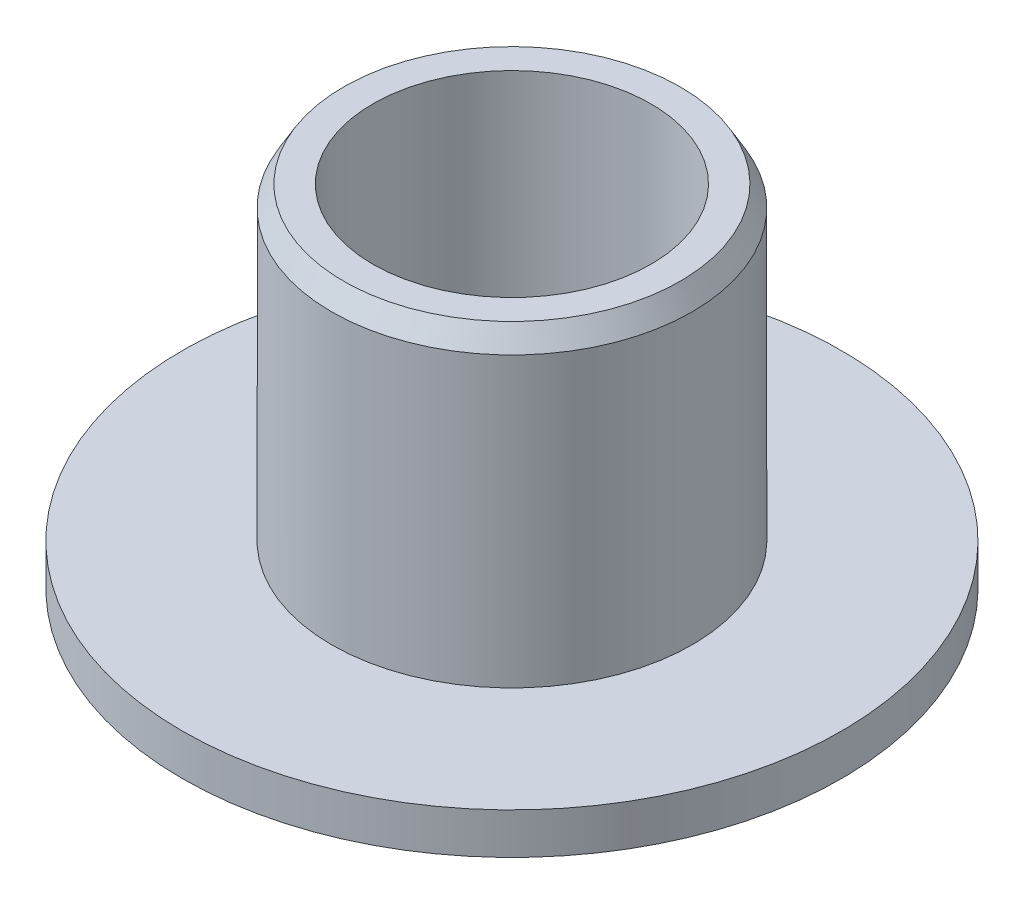
ISO-10303-21;
HEADER;
FILE_DESCRIPTION(('STEP AP214'),'2;1');
FILE_NAME('part.step','',(''),(''),'','','');
FILE_SCHEMA(('AUTOMOTIVE_DESIGN { 1 0 10303 214 1 1 1 1 }'));
ENDSEC;
DATA;
#1=APPLICATION_CONTEXT('core data for automotive mechanical design processes');
#2=APPLICATION_PROTOCOL_DEFINITION('international standard','automotive_design',2000,#1);
#3=PRODUCT_CONTEXT('',#1,'mechanical');
#4=PRODUCT('Part','Part','',(#3));
#5=PRODUCT_RELATED_PRODUCT_CATEGORY('part','',(#4));
#6=PRODUCT_DEFINITION_FORMATION('','',#4);
#7=PRODUCT_DEFINITION_CONTEXT('part definition',#1,'design');
#8=PRODUCT_DEFINITION('design','',#6,#7);
#9=PRODUCT_DEFINITION_SHAPE('','',#8);
#10=(LENGTH_UNIT() NAMED_UNIT(*) SI_UNIT(.MILLI.,.METRE.));
#11=(NAMED_UNIT(*) PLANE_ANGLE_UNIT() SI_UNIT($,.RADIAN.));
#12=(NAMED_UNIT(*) SI_UNIT($,.STERADIAN.) SOLID_ANGLE_UNIT());
#13=UNCERTAINTY_MEASURE_WITH_UNIT(LENGTH_MEASURE(1.E-05),#10,'distance_accuracy_value','');
#14=(GEOMETRIC_REPRESENTATION_CONTEXT(3) GLOBAL_UNCERTAINTY_ASSIGNED_CONTEXT((#13)) GLOBAL_UNIT_ASSIGNED_CONTEXT((#10,
#11,#12)) REPRESENTATION_CONTEXT('',''));
#15=CARTESIAN_POINT('',(0.,0.,0.));
#16=DIRECTION('',(0.,0.,1.));
#17=DIRECTION('',(1.,0.,0.));
#18=AXIS2_PLACEMENT_3D('',#15,#16,#17);
#19=CARTESIAN_POINT('',(0.,2.,0.));
#20=DIRECTION('',(0.,-1.,0.));
#21=DIRECTION('',(0.,0.,-1.));
#22=AXIS2_PLACEMENT_3D('',#19,#20,#21);
#23=PLANE('',#22);
#24=CARTESIAN_POINT('',(0.,2.,0.));
#25=DIRECTION('',(0.,1.,0.));
#26=DIRECTION('',(0.,0.,1.));
#27=AXIS2_PLACEMENT_3D('',#24,#25,#26);
#28=CIRCLE('',#27,2.5);
#29=CARTESIAN_POINT('',(0.,2.,2.5));
#30=VERTEX_POINT('',#29);
#31=EDGE_CURVE('E74',#30,#30,#28,.T.);
#32=ORIENTED_EDGE('',*,*,#31,.T.);
#33=EDGE_LOOP('',(#32));
#34=FACE_BOUND('',#33,.T.);
#35=ADVANCED_FACE('F44',(#34),#23,.F.);
#36=CARTESIAN_POINT('',(0.,6.53333333333333,0.));
#37=DIRECTION('',(0.,1.,0.));
#38=DIRECTION('',(0.,0.,1.));
#39=AXIS2_PLACEMENT_3D('',#36,#37,#38);
#40=CONICAL_SURFACE('',#39,6.75,0.753151280962194);
#41=ORIENTED_EDGE('',*,*,#31,.F.);
#42=EDGE_LOOP('',(#41));
#43=FACE_BOUND('',#42,.T.);
#44=CARTESIAN_POINT('',(0.,6.53333333333333,0.));
#45=DIRECTION('',(0.,1.,0.));
#46=DIRECTION('',(0.,0.,1.));
#47=AXIS2_PLACEMENT_3D('',#44,#45,#46);
#48=CIRCLE('',#47,6.75);
#49=CARTESIAN_POINT('',(0.,6.53333333333333,6.75));
#50=VERTEX_POINT('',#49);
#51=EDGE_CURVE('E78',#50,#50,#48,.T.);
#52=ORIENTED_EDGE('',*,*,#51,.T.);
#53=EDGE_LOOP('',(#52));
#54=FACE_BOUND('',#53,.T.);
#55=ADVANCED_FACE('F113',(#43,#54),#40,.F.);
#56=CARTESIAN_POINT('',(0.,21.6230439326638,0.));
#57=DIRECTION('',(0.,1.,0.));
#58=DIRECTION('',(0.,0.,1.));
#59=AXIS2_PLACEMENT_3D('',#56,#57,#58);
#60=CYLINDRICAL_SURFACE('',#59,6.75);
#61=ORIENTED_EDGE('',*,*,#51,.F.);
#62=EDGE_LOOP('',(#61));
#63=FACE_BOUND('',#62,.T.);
#64=CARTESIAN_POINT('',(0.,17.,0.));
#65=DIRECTION('',(0.,1.,0.));
#66=DIRECTION('',(0.,0.,1.));
#67=AXIS2_PLACEMENT_3D('',#64,#65,#66);
#68=CIRCLE('',#67,6.75);
#69=CARTESIAN_POINT('',(0.,17.,6.75));
#70=VERTEX_POINT('',#69);
#71=EDGE_CURVE('E82',#70,#70,#68,.T.);
#72=ORIENTED_EDGE('',*,*,#71,.T.);
#73=EDGE_LOOP('',(#72));
#74=FACE_BOUND('',#73,.T.);
#75=ADVANCED_FACE('F119',(#63,#74),#60,.F.);
#76=CARTESIAN_POINT('',(6.75,17.,0.));
#77=DIRECTION('',(0.,-1.,0.));
#78=DIRECTION('',(0.,0.,-1.));
#79=AXIS2_PLACEMENT_3D('',#76,#77,#78);
#80=PLANE('',#79);
#81=CARTESIAN_POINT('',(0.,17.,0.));
#82=DIRECTION('',(0.,-1.,0.));
#83=DIRECTION('',(0.,0.,-1.));
#84=AXIS2_PLACEMENT_3D('',#81,#82,#83);
#85=CIRCLE('',#84,8.17264973081037);
#86=CARTESIAN_POINT('',(0.,17.,-8.17264973081037));
#87=VERTEX_POINT('',#86);
#88=EDGE_CURVE('E54',#87,#87,#85,.F.);
#89=ORIENTED_EDGE('',*,*,#88,.T.);
#90=EDGE_LOOP('',(#89));
#91=FACE_BOUND('',#90,.T.);
#92=ORIENTED_EDGE('',*,*,#71,.F.);
#93=EDGE_LOOP('',(#92));
#94=FACE_BOUND('',#93,.T.);
#95=ADVANCED_FACE('F160',(#91,#94),#80,.F.);
#96=CARTESIAN_POINT('',(0.,21.6230439326638,0.));
#97=DIRECTION('',(0.,1.,0.));
#98=DIRECTION('',(0.,0.,1.));
#99=AXIS2_PLACEMENT_3D('',#96,#97,#98);
#100=CYLINDRICAL_SURFACE('',#99,8.75);
#101=CARTESIAN_POINT('',(0.,16.,0.));
#102=DIRECTION('',(0.,-1.,0.));
#103=DIRECTION('',(0.,0.,-1.));
#104=AXIS2_PLACEMENT_3D('',#101,#102,#103);
#105=CIRCLE('',#104,8.75);
#106=CARTESIAN_POINT('',(0.,16.,-8.75));
#107=VERTEX_POINT('',#106);
#108=EDGE_CURVE('E10',#107,#107,#105,.T.);
#109=ORIENTED_EDGE('',*,*,#108,.T.);
#110=EDGE_LOOP('',(#109));
#111=FACE_BOUND('',#110,.T.);
#112=CARTESIAN_POINT('',(0.,2.,0.));
#113=DIRECTION('',(0.,1.,0.));
#114=DIRECTION('',(0.,0.,1.));
#115=AXIS2_PLACEMENT_3D('',#112,#113,#114);
#116=CIRCLE('',#115,8.75);
#117=CARTESIAN_POINT('',(0.,2.,8.75));
#118=VERTEX_POINT('',#117);
#119=EDGE_CURVE('E86',#118,#118,#116,.T.);
#120=ORIENTED_EDGE('',*,*,#119,.T.);
#121=EDGE_LOOP('',(#120));
#122=FACE_BOUND('',#121,.T.);
#123=ADVANCED_FACE('F165',(#111,#122),#100,.T.);
#124=CARTESIAN_POINT('',(16.,2.,0.));
#125=DIRECTION('',(0.,-1.,0.));
#126=DIRECTION('',(0.,0.,-1.));
#127=AXIS2_PLACEMENT_3D('',#124,#125,#126);
#128=PLANE('',#127);
#129=ORIENTED_EDGE('',*,*,#119,.F.);
#130=EDGE_LOOP('',(#129));
#131=FACE_BOUND('',#130,.T.);
#132=CARTESIAN_POINT('',(0.,2.,0.));
#133=DIRECTION('',(0.,1.,0.));
#134=DIRECTION('',(0.,0.,1.));
#135=AXIS2_PLACEMENT_3D('',#132,#133,#134);
#136=CIRCLE('',#135,16.);
#137=CARTESIAN_POINT('',(0.,2.,16.));
#138=VERTEX_POINT('',#137);
#139=EDGE_CURVE('E90',#138,#138,#136,.T.);
#140=ORIENTED_EDGE('',*,*,#139,.T.);
#141=EDGE_LOOP('',(#140));
#142=FACE_BOUND('',#141,.T.);
#143=ADVANCED_FACE('F109',(#131,#142),#128,.F.);
#144=CARTESIAN_POINT('',(0.,21.6230439326638,0.));
#145=DIRECTION('',(0.,1.,0.));
#146=DIRECTION('',(0.,0.,1.));
#147=AXIS2_PLACEMENT_3D('',#144,#145,#146);
#148=CYLINDRICAL_SURFACE('',#147,16.);
#149=ORIENTED_EDGE('',*,*,#139,.F.);
#150=EDGE_LOOP('',(#149));
#151=FACE_BOUND('',#150,.T.);
#152=CARTESIAN_POINT('',(0.,0.,0.));
#153=DIRECTION('',(0.,1.,0.));
#154=DIRECTION('',(0.,0.,1.));
#155=AXIS2_PLACEMENT_3D('',#152,#153,#154);
#156=CIRCLE('',#155,16.);
#157=CARTESIAN_POINT('',(0.,0.,16.));
#158=VERTEX_POINT('',#157);
#159=EDGE_CURVE('E94',#158,#158,#156,.T.);
#160=ORIENTED_EDGE('',*,*,#159,.T.);
#161=EDGE_LOOP('',(#160));
#162=FACE_BOUND('',#161,.T.);
#163=ADVANCED_FACE('F99',(#151,#162),#148,.T.);
#164=CARTESIAN_POINT('',(0.,0.,0.));
#165=DIRECTION('',(0.,1.,0.));
#166=DIRECTION('',(0.,0.,1.));
#167=AXIS2_PLACEMENT_3D('',#164,#165,#166);
#168=PLANE('',#167);
#169=ORIENTED_EDGE('',*,*,#159,.F.);
#170=EDGE_LOOP('',(#169));
#171=FACE_BOUND('',#170,.T.);
#172=ADVANCED_FACE('F101',(#171),#168,.F.);
#173=CARTESIAN_POINT('',(0.,17.,0.));
#174=DIRECTION('',(0.,-1.,0.));
#175=DIRECTION('',(0.,0.,-1.));
#176=AXIS2_PLACEMENT_3D('',#173,#174,#175);
#177=CONICAL_SURFACE('',#176,8.17264973081037,0.523598775598299);
#178=ORIENTED_EDGE('',*,*,#108,.F.);
#179=EDGE_LOOP('',(#178));
#180=FACE_BOUND('',#179,.T.);
#181=ORIENTED_EDGE('',*,*,#88,.F.);
#182=EDGE_LOOP('',(#181));
#183=FACE_BOUND('',#182,.T.);
#184=ADVANCED_FACE('F47',(#180,#183),#177,.T.);
#185=CLOSED_SHELL('',(#35,#55,#75,#95,#123,#143,#163,#172,#184));
#186=CARTESIAN_POINT('',(3.5,2.,0.));
#187=DIRECTION('',(0.,1.,0.));
#188=DIRECTION('',(0.,0.,1.));
#189=AXIS2_PLACEMENT_3D('',#186,#187,#188);
#190=PLANE('',#189);
#191=CARTESIAN_POINT('',(0.,2.,0.));
#192=DIRECTION('',(0.,1.,0.));
#193=DIRECTION('',(0.,0.,1.));
#194=AXIS2_PLACEMENT_3D('',#191,#192,#193);
#195=CIRCLE('',#194,6.75);
#196=CARTESIAN_POINT('',(0.,2.,6.75));
#197=VERTEX_POINT('',#196);
#198=EDGE_CURVE('E59',#197,#197,#195,.T.);
#199=ORIENTED_EDGE('',*,*,#198,.T.);
#200=EDGE_LOOP('',(#199));
#201=FACE_BOUND('',#200,.T.);
#202=CARTESIAN_POINT('',(0.,2.,0.));
#203=DIRECTION('',(0.,1.,0.));
#204=DIRECTION('',(0.,0.,1.));
#205=AXIS2_PLACEMENT_3D('',#202,#203,#204);
#206=CIRCLE('',#205,3.5);
#207=CARTESIAN_POINT('',(0.,2.,3.5));
#208=VERTEX_POINT('',#207);
#209=EDGE_CURVE('E70',#208,#208,#206,.T.);
#210=ORIENTED_EDGE('',*,*,#209,.F.);
#211=EDGE_LOOP('',(#210));
#212=FACE_BOUND('',#211,.T.);
#213=ADVANCED_FACE('F131',(#201,#212),#190,.T.);
#214=CARTESIAN_POINT('',(0.,21.6230439326638,0.));
#215=DIRECTION('',(0.,1.,0.));
#216=DIRECTION('',(0.,0.,1.));
#217=AXIS2_PLACEMENT_3D('',#214,#215,#216);
#218=CYLINDRICAL_SURFACE('',#217,6.75);
#219=CARTESIAN_POINT('',(0.,5.46666666666667,0.));
#220=DIRECTION('',(0.,1.,0.));
#221=DIRECTION('',(0.,0.,1.));
#222=AXIS2_PLACEMENT_3D('',#219,#220,#221);
#223=CIRCLE('',#222,6.75);
#224=CARTESIAN_POINT('',(0.,5.46666666666667,6.75));
#225=VERTEX_POINT('',#224);
#226=EDGE_CURVE('E64',#225,#225,#223,.T.);
#227=ORIENTED_EDGE('',*,*,#226,.T.);
#228=EDGE_LOOP('',(#227));
#229=FACE_BOUND('',#228,.T.);
#230=ORIENTED_EDGE('',*,*,#198,.F.);
#231=EDGE_LOOP('',(#230));
#232=FACE_BOUND('',#231,.T.);
#233=ADVANCED_FACE('F127',(#229,#232),#218,.F.);
#234=CARTESIAN_POINT('',(0.,5.46666666666667,0.));
#235=DIRECTION('',(0.,1.,0.));
#236=DIRECTION('',(0.,0.,1.));
#237=AXIS2_PLACEMENT_3D('',#234,#235,#236);
#238=CONICAL_SURFACE('',#237,6.75,0.753151280962194);
#239=ORIENTED_EDGE('',*,*,#209,.T.);
#240=EDGE_LOOP('',(#239));
#241=FACE_BOUND('',#240,.T.);
#242=ORIENTED_EDGE('',*,*,#226,.F.);
#243=EDGE_LOOP('',(#242));
#244=FACE_BOUND('',#243,.T.);
#245=ADVANCED_FACE('F124',(#241,#244),#238,.T.);
#246=CLOSED_SHELL('',(#213,#233,#245));
#247=ORIENTED_CLOSED_SHELL('',*,#246,.T.);
#248=BREP_WITH_VOIDS('B2',#185,(#247));
#249=ADVANCED_BREP_SHAPE_REPRESENTATION('',(#18,#248),#14);
#250=SHAPE_DEFINITION_REPRESENTATION(#9,#249);
ENDSEC;
END-ISO-10303-21;
